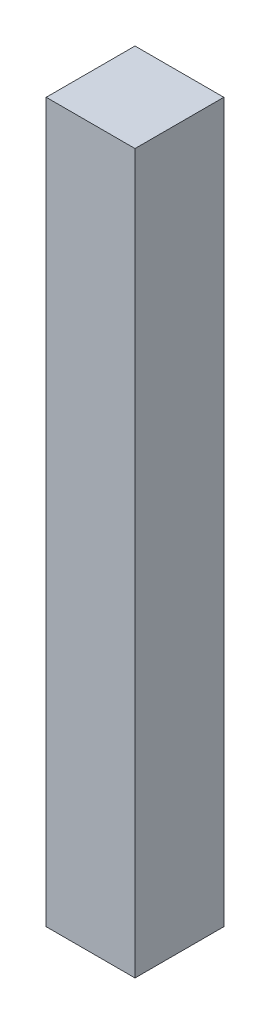
ISO-10303-21;
HEADER;
FILE_DESCRIPTION(('STEP AP214'),'2;1');
FILE_NAME('part.step','',(''),(''),'','','');
FILE_SCHEMA(('AUTOMOTIVE_DESIGN { 1 0 10303 214 1 1 1 1 }'));
ENDSEC;
DATA;
#1=APPLICATION_CONTEXT('core data for automotive mechanical design processes');
#2=APPLICATION_PROTOCOL_DEFINITION('international standard','automotive_design',2000,#1);
#3=PRODUCT_CONTEXT('',#1,'mechanical');
#4=PRODUCT('Part','Part','',(#3));
#5=PRODUCT_RELATED_PRODUCT_CATEGORY('part','',(#4));
#6=PRODUCT_DEFINITION_FORMATION('','',#4);
#7=PRODUCT_DEFINITION_CONTEXT('part definition',#1,'design');
#8=PRODUCT_DEFINITION('design','',#6,#7);
#9=PRODUCT_DEFINITION_SHAPE('','',#8);
#10=(LENGTH_UNIT() NAMED_UNIT(*) SI_UNIT(.MILLI.,.METRE.));
#11=(NAMED_UNIT(*) PLANE_ANGLE_UNIT() SI_UNIT($,.RADIAN.));
#12=(NAMED_UNIT(*) SI_UNIT($,.STERADIAN.) SOLID_ANGLE_UNIT());
#13=UNCERTAINTY_MEASURE_WITH_UNIT(LENGTH_MEASURE(1.E-05),#10,'distance_accuracy_value','');
#14=(GEOMETRIC_REPRESENTATION_CONTEXT(3) GLOBAL_UNCERTAINTY_ASSIGNED_CONTEXT((#13)) GLOBAL_UNIT_ASSIGNED_CONTEXT((#10,
#11,#12)) REPRESENTATION_CONTEXT('',''));
#15=CARTESIAN_POINT('',(0.,0.,0.));
#16=DIRECTION('',(0.,0.,1.));
#17=DIRECTION('',(1.,0.,0.));
#18=AXIS2_PLACEMENT_3D('',#15,#16,#17);
#19=CARTESIAN_POINT('',(0.,190.075535480964,0.));
#20=DIRECTION('',(1.,0.,0.));
#21=DIRECTION('',(0.,0.,-1.));
#22=AXIS2_PLACEMENT_3D('',#19,#20,#21);
#23=PLANE('',#22);
#24=DIRECTION('',(0.,0.,1.));
#25=VECTOR('',#24,1.);
#26=CARTESIAN_POINT('',(0.,161.791264233502,0.));
#27=LINE('',#26,#25);
#28=CARTESIAN_POINT('',(0.,161.791264233502,0.));
#29=VERTEX_POINT('',#28);
#30=CARTESIAN_POINT('',(0.,161.791264233502,19.9999999999994));
#31=VERTEX_POINT('',#30);
#32=EDGE_CURVE('E41',#29,#31,#27,.T.);
#33=ORIENTED_EDGE('',*,*,#32,.F.);
#34=DIRECTION('',(0.,-1.,0.));
#35=VECTOR('',#34,1.);
#36=CARTESIAN_POINT('',(0.,190.075535480964,0.));
#37=LINE('',#36,#35);
#38=CARTESIAN_POINT('',(0.,0.,0.));
#39=VERTEX_POINT('',#38);
#40=EDGE_CURVE('E90',#29,#39,#37,.T.);
#41=ORIENTED_EDGE('',*,*,#40,.T.);
#42=DIRECTION('',(0.,0.,1.));
#43=VECTOR('',#42,1.);
#44=CARTESIAN_POINT('',(0.,0.,0.));
#45=LINE('',#44,#43);
#46=CARTESIAN_POINT('',(0.,0.,20.));
#47=VERTEX_POINT('',#46);
#48=EDGE_CURVE('E85',#39,#47,#45,.T.);
#49=ORIENTED_EDGE('',*,*,#48,.T.);
#50=DIRECTION('',(0.,-1.,0.));
#51=VECTOR('',#50,1.);
#52=CARTESIAN_POINT('',(0.,190.075535480964,20.));
#53=LINE('',#52,#51);
#54=EDGE_CURVE('E70',#31,#47,#53,.T.);
#55=ORIENTED_EDGE('',*,*,#54,.F.);
#56=EDGE_LOOP('',(#33,#41,#49,#55));
#57=FACE_BOUND('',#56,.T.);
#58=ADVANCED_FACE('F33',(#57),#23,.F.);
#59=CARTESIAN_POINT('',(0.,190.075535480964,20.));
#60=DIRECTION('',(0.,0.,-1.));
#61=DIRECTION('',(-1.,0.,0.));
#62=AXIS2_PLACEMENT_3D('',#59,#60,#61);
#63=PLANE('',#62);
#64=DIRECTION('',(1.,0.,0.));
#65=VECTOR('',#64,1.);
#66=CARTESIAN_POINT('',(0.,161.791264233502,20.));
#67=LINE('',#66,#65);
#68=CARTESIAN_POINT('',(20.0000000000013,161.791264233502,19.9999999999994));
#69=VERTEX_POINT('',#68);
#70=EDGE_CURVE('E36',#31,#69,#67,.T.);
#71=ORIENTED_EDGE('',*,*,#70,.F.);
#72=ORIENTED_EDGE('',*,*,#54,.T.);
#73=DIRECTION('',(1.,0.,0.));
#74=VECTOR('',#73,1.);
#75=CARTESIAN_POINT('',(0.,0.,20.));
#76=LINE('',#75,#74);
#77=CARTESIAN_POINT('',(20.,0.,20.));
#78=VERTEX_POINT('',#77);
#79=EDGE_CURVE('E74',#47,#78,#76,.T.);
#80=ORIENTED_EDGE('',*,*,#79,.T.);
#81=DIRECTION('',(0.,-1.,0.));
#82=VECTOR('',#81,1.);
#83=CARTESIAN_POINT('',(20.,190.075535480964,20.));
#84=LINE('',#83,#82);
#85=EDGE_CURVE('E79',#69,#78,#84,.T.);
#86=ORIENTED_EDGE('',*,*,#85,.F.);
#87=EDGE_LOOP('',(#71,#72,#80,#86));
#88=FACE_BOUND('',#87,.T.);
#89=ADVANCED_FACE('F72',(#88),#63,.F.);
#90=CARTESIAN_POINT('',(20.,190.075535480964,0.));
#91=DIRECTION('',(-1.,0.,0.));
#92=DIRECTION('',(0.,0.,1.));
#93=AXIS2_PLACEMENT_3D('',#90,#91,#92);
#94=PLANE('',#93);
#95=DIRECTION('',(0.,0.,-1.));
#96=VECTOR('',#95,1.);
#97=CARTESIAN_POINT('',(20.,161.791264233502,0.));
#98=LINE('',#97,#96);
#99=CARTESIAN_POINT('',(20.,161.791264233502,0.));
#100=VERTEX_POINT('',#99);
#101=EDGE_CURVE('E78',#69,#100,#98,.T.);
#102=ORIENTED_EDGE('',*,*,#101,.F.);
#103=ORIENTED_EDGE('',*,*,#85,.T.);
#104=DIRECTION('',(0.,0.,-1.));
#105=VECTOR('',#104,1.);
#106=CARTESIAN_POINT('',(20.,0.,0.));
#107=LINE('',#106,#105);
#108=CARTESIAN_POINT('',(20.,0.,0.));
#109=VERTEX_POINT('',#108);
#110=EDGE_CURVE('E87',#78,#109,#107,.T.);
#111=ORIENTED_EDGE('',*,*,#110,.T.);
#112=DIRECTION('',(0.,-1.,0.));
#113=VECTOR('',#112,1.);
#114=CARTESIAN_POINT('',(20.,190.075535480964,0.));
#115=LINE('',#114,#113);
#116=EDGE_CURVE('E99',#100,#109,#115,.T.);
#117=ORIENTED_EDGE('',*,*,#116,.F.);
#118=EDGE_LOOP('',(#102,#103,#111,#117));
#119=FACE_BOUND('',#118,.T.);
#120=ADVANCED_FACE('F105',(#119),#94,.F.);
#121=CARTESIAN_POINT('',(0.,190.075535480964,0.));
#122=DIRECTION('',(0.,0.,1.));
#123=DIRECTION('',(1.,0.,0.));
#124=AXIS2_PLACEMENT_3D('',#121,#122,#123);
#125=PLANE('',#124);
#126=DIRECTION('',(-1.,0.,0.));
#127=VECTOR('',#126,1.);
#128=CARTESIAN_POINT('',(0.,161.791264233502,0.));
#129=LINE('',#128,#127);
#130=EDGE_CURVE('E11',#100,#29,#129,.T.);
#131=ORIENTED_EDGE('',*,*,#130,.F.);
#132=ORIENTED_EDGE('',*,*,#116,.T.);
#133=DIRECTION('',(-1.,0.,0.));
#134=VECTOR('',#133,1.);
#135=CARTESIAN_POINT('',(0.,0.,0.));
#136=LINE('',#135,#134);
#137=EDGE_CURVE('E96',#109,#39,#136,.T.);
#138=ORIENTED_EDGE('',*,*,#137,.T.);
#139=ORIENTED_EDGE('',*,*,#40,.F.);
#140=EDGE_LOOP('',(#131,#132,#138,#139));
#141=FACE_BOUND('',#140,.T.);
#142=ADVANCED_FACE('F107',(#141),#125,.F.);
#143=CARTESIAN_POINT('',(0.,0.,0.));
#144=DIRECTION('',(0.,1.,0.));
#145=DIRECTION('',(0.,0.,1.));
#146=AXIS2_PLACEMENT_3D('',#143,#144,#145);
#147=PLANE('',#146);
#148=ORIENTED_EDGE('',*,*,#48,.F.);
#149=ORIENTED_EDGE('',*,*,#137,.F.);
#150=ORIENTED_EDGE('',*,*,#110,.F.);
#151=ORIENTED_EDGE('',*,*,#79,.F.);
#152=EDGE_LOOP('',(#148,#149,#150,#151));
#153=FACE_BOUND('',#152,.T.);
#154=ADVANCED_FACE('F83',(#153),#147,.F.);
#155=CARTESIAN_POINT('',(-0.299999999996636,161.791264233502,19.9999999999994));
#156=DIRECTION('',(0.,1.,0.));
#157=DIRECTION('',(-0.819812743717898,0.,0.572631701216176));
#158=AXIS2_PLACEMENT_3D('',#155,#156,#157);
#159=PLANE('',#158);
#160=ORIENTED_EDGE('',*,*,#32,.T.);
#161=ORIENTED_EDGE('',*,*,#70,.T.);
#162=ORIENTED_EDGE('',*,*,#101,.T.);
#163=ORIENTED_EDGE('',*,*,#130,.T.);
#164=EDGE_LOOP('',(#160,#161,#162,#163));
#165=FACE_BOUND('',#164,.T.);
#166=ADVANCED_FACE('F102',(#165),#159,.T.);
#167=CLOSED_SHELL('',(#58,#89,#120,#142,#154,#166));
#168=MANIFOLD_SOLID_BREP('B2',#167);
#169=ADVANCED_BREP_SHAPE_REPRESENTATION('',(#18,#168),#14);
#170=SHAPE_DEFINITION_REPRESENTATION(#9,#169);
ENDSEC;
END-ISO-10303-21;
